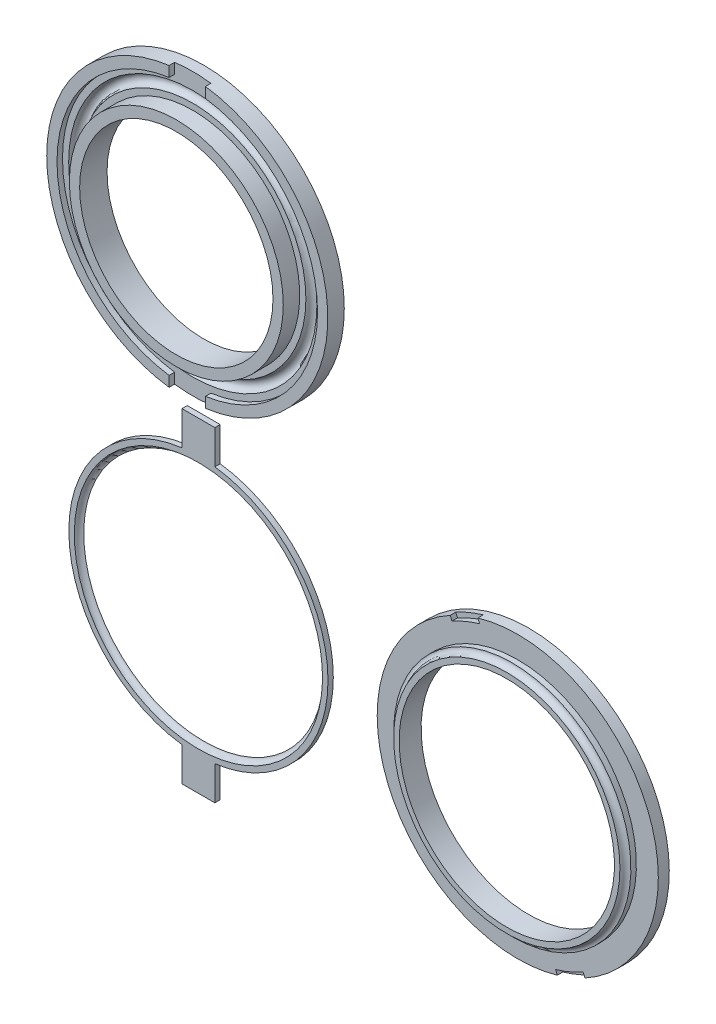
ISO-10303-21;
HEADER;
FILE_DESCRIPTION(('STEP AP214'),'2;1');
FILE_NAME('part.step','',(''),(''),'','','');
FILE_SCHEMA(('AUTOMOTIVE_DESIGN { 1 0 10303 214 1 1 1 1 }'));
ENDSEC;
DATA;
#1=APPLICATION_CONTEXT('core data for automotive mechanical design processes');
#2=APPLICATION_PROTOCOL_DEFINITION('international standard','automotive_design',2000,#1);
#3=PRODUCT_CONTEXT('',#1,'mechanical');
#4=PRODUCT('Part','Part','',(#3));
#5=PRODUCT_RELATED_PRODUCT_CATEGORY('part','',(#4));
#6=PRODUCT_DEFINITION_FORMATION('','',#4);
#7=PRODUCT_DEFINITION_CONTEXT('part definition',#1,'design');
#8=PRODUCT_DEFINITION('design','',#6,#7);
#9=PRODUCT_DEFINITION_SHAPE('','',#8);
#10=(LENGTH_UNIT() NAMED_UNIT(*) SI_UNIT(.MILLI.,.METRE.));
#11=(NAMED_UNIT(*) PLANE_ANGLE_UNIT() SI_UNIT($,.RADIAN.));
#12=(NAMED_UNIT(*) SI_UNIT($,.STERADIAN.) SOLID_ANGLE_UNIT());
#13=UNCERTAINTY_MEASURE_WITH_UNIT(LENGTH_MEASURE(1.E-05),#10,'distance_accuracy_value','');
#14=(GEOMETRIC_REPRESENTATION_CONTEXT(3) GLOBAL_UNCERTAINTY_ASSIGNED_CONTEXT((#13)) GLOBAL_UNIT_ASSIGNED_CONTEXT((#10,
#11,#12)) REPRESENTATION_CONTEXT('',''));
#15=CARTESIAN_POINT('',(0.,0.,0.));
#16=DIRECTION('',(0.,0.,1.));
#17=DIRECTION('',(1.,0.,0.));
#18=AXIS2_PLACEMENT_3D('',#15,#16,#17);
#19=CARTESIAN_POINT('',(0.,47.4,1.62540333075852));
#20=DIRECTION('',(0.,0.,-1.));
#21=DIRECTION('',(-1.,0.,0.));
#22=AXIS2_PLACEMENT_3D('',#19,#20,#21);
#23=CYLINDRICAL_SURFACE('',#22,19.);
#24=CARTESIAN_POINT('',(0.,47.4,1.62540333075852));
#25=DIRECTION('',(0.,0.,1.));
#26=DIRECTION('',(1.,0.,0.));
#27=AXIS2_PLACEMENT_3D('',#24,#25,#26);
#28=CIRCLE('',#27,19.);
#29=CARTESIAN_POINT('',(-2.65,66.2142897819716,1.62540333075852));
#30=VERTEX_POINT('',#29);
#31=CARTESIAN_POINT('',(-2.65,28.5857102180284,1.62540333075852));
#32=VERTEX_POINT('',#31);
#33=EDGE_CURVE('E437',#30,#32,#28,.T.);
#34=ORIENTED_EDGE('',*,*,#33,.T.);
#35=DIRECTION('',(0.,0.,1.));
#36=VECTOR('',#35,1.);
#37=CARTESIAN_POINT('',(-2.65,28.5857102180284,-4.73621684138246));
#38=LINE('',#37,#36);
#39=CARTESIAN_POINT('',(-2.65,28.5857102180284,0.825403330758516));
#40=VERTEX_POINT('',#39);
#41=EDGE_CURVE('E109',#40,#32,#38,.T.);
#42=ORIENTED_EDGE('',*,*,#41,.F.);
#43=CARTESIAN_POINT('',(0.,47.4,0.825403330758516));
#44=DIRECTION('',(0.,0.,1.));
#45=DIRECTION('',(1.,0.,0.));
#46=AXIS2_PLACEMENT_3D('',#43,#44,#45);
#47=CIRCLE('',#46,19.);
#48=CARTESIAN_POINT('',(-2.65,66.2142897819716,0.825403330758516));
#49=VERTEX_POINT('',#48);
#50=EDGE_CURVE('E182',#49,#40,#47,.T.);
#51=ORIENTED_EDGE('',*,*,#50,.F.);
#52=DIRECTION('',(0.,0.,1.));
#53=VECTOR('',#52,1.);
#54=CARTESIAN_POINT('',(-2.65,66.2142897819716,-4.73621684138246));
#55=LINE('',#54,#53);
#56=EDGE_CURVE('E452',#49,#30,#55,.T.);
#57=ORIENTED_EDGE('',*,*,#56,.T.);
#58=EDGE_LOOP('',(#34,#42,#51,#57));
#59=FACE_BOUND('',#58,.T.);
#60=ADVANCED_FACE('F86',(#59),#23,.F.);
#61=CARTESIAN_POINT('',(0.,47.4,1.62540333075852));
#62=DIRECTION('',(0.,0.,1.));
#63=DIRECTION('',(1.,0.,0.));
#64=AXIS2_PLACEMENT_3D('',#61,#62,#63);
#65=PLANE('',#64);
#66=CARTESIAN_POINT('',(0.,47.4,1.62540333075852));
#67=DIRECTION('',(0.,0.,1.));
#68=DIRECTION('',(1.,0.,0.));
#69=AXIS2_PLACEMENT_3D('',#66,#67,#68);
#70=CIRCLE('',#69,20.5);
#71=CARTESIAN_POINT('',(-2.65,67.7279979338842,1.62540333075852));
#72=VERTEX_POINT('',#71);
#73=CARTESIAN_POINT('',(-2.65,27.0720020661158,1.62540333075852));
#74=VERTEX_POINT('',#73);
#75=EDGE_CURVE('E196',#72,#74,#70,.T.);
#76=ORIENTED_EDGE('',*,*,#75,.T.);
#77=DIRECTION('',(0.,1.,0.));
#78=VECTOR('',#77,1.);
#79=CARTESIAN_POINT('',(-2.65,0.,1.62540333075852));
#80=LINE('',#79,#78);
#81=EDGE_CURVE('E463',#74,#32,#80,.T.);
#82=ORIENTED_EDGE('',*,*,#81,.T.);
#83=ORIENTED_EDGE('',*,*,#33,.F.);
#84=DIRECTION('',(0.,1.,0.));
#85=VECTOR('',#84,1.);
#86=CARTESIAN_POINT('',(-2.65,0.,1.62540333075852));
#87=LINE('',#86,#85);
#88=EDGE_CURVE('E454',#30,#72,#87,.T.);
#89=ORIENTED_EDGE('',*,*,#88,.T.);
#90=EDGE_LOOP('',(#76,#82,#83,#89));
#91=FACE_BOUND('',#90,.T.);
#92=ADVANCED_FACE('F229',(#91),#65,.T.);
#93=CARTESIAN_POINT('',(0.,47.4,1.62540333075852));
#94=DIRECTION('',(0.,0.,-1.));
#95=DIRECTION('',(-1.,0.,0.));
#96=AXIS2_PLACEMENT_3D('',#93,#94,#95);
#97=CYLINDRICAL_SURFACE('',#96,14.1);
#98=CARTESIAN_POINT('',(0.,47.4,3.22540333075852));
#99=DIRECTION('',(0.,0.,1.));
#100=DIRECTION('',(1.,0.,0.));
#101=AXIS2_PLACEMENT_3D('',#98,#99,#100);
#102=CIRCLE('',#101,14.1);
#103=CARTESIAN_POINT('',(14.1,47.4,3.22540333075852));
#104=VERTEX_POINT('',#103);
#105=EDGE_CURVE('E94',#104,#104,#102,.T.);
#106=ORIENTED_EDGE('',*,*,#105,.T.);
#107=EDGE_LOOP('',(#106));
#108=FACE_BOUND('',#107,.T.);
#109=CARTESIAN_POINT('',(0.,47.4,-0.774596669241484));
#110=DIRECTION('',(0.,0.,-1.));
#111=DIRECTION('',(-1.,0.,0.));
#112=AXIS2_PLACEMENT_3D('',#109,#110,#111);
#113=CIRCLE('',#112,14.1);
#114=CARTESIAN_POINT('',(-14.1,47.4,-0.774596669241484));
#115=VERTEX_POINT('',#114);
#116=EDGE_CURVE('E204',#115,#115,#113,.T.);
#117=ORIENTED_EDGE('',*,*,#116,.T.);
#118=EDGE_LOOP('',(#117));
#119=FACE_BOUND('',#118,.T.);
#120=ADVANCED_FACE('F88',(#108,#119),#97,.F.);
#121=CARTESIAN_POINT('',(0.,47.4,1.62540333075852));
#122=DIRECTION('',(0.,0.,-1.));
#123=DIRECTION('',(-1.,0.,0.));
#124=AXIS2_PLACEMENT_3D('',#121,#122,#123);
#125=CYLINDRICAL_SURFACE('',#124,15.6);
#126=CARTESIAN_POINT('',(0.,47.4,0.825403330758516));
#127=DIRECTION('',(0.,0.,-1.));
#128=DIRECTION('',(-1.,0.,0.));
#129=AXIS2_PLACEMENT_3D('',#126,#127,#128);
#130=CIRCLE('',#129,15.6);
#131=CARTESIAN_POINT('',(-15.6,47.4,0.825403330758516));
#132=VERTEX_POINT('',#131);
#133=EDGE_CURVE('E207',#132,#132,#130,.T.);
#134=ORIENTED_EDGE('',*,*,#133,.F.);
#135=EDGE_LOOP('',(#134));
#136=FACE_BOUND('',#135,.T.);
#137=CARTESIAN_POINT('',(0.,47.4,3.22540333075852));
#138=DIRECTION('',(0.,0.,1.));
#139=DIRECTION('',(1.,0.,0.));
#140=AXIS2_PLACEMENT_3D('',#137,#138,#139);
#141=CIRCLE('',#140,15.6);
#142=CARTESIAN_POINT('',(15.6,47.4,3.22540333075852));
#143=VERTEX_POINT('',#142);
#144=EDGE_CURVE('E14',#143,#143,#141,.T.);
#145=ORIENTED_EDGE('',*,*,#144,.F.);
#146=EDGE_LOOP('',(#145));
#147=FACE_BOUND('',#146,.T.);
#148=ADVANCED_FACE('F217',(#136,#147),#125,.T.);
#149=CARTESIAN_POINT('',(0.,47.4,3.22540333075852));
#150=DIRECTION('',(0.,0.,1.));
#151=DIRECTION('',(1.,0.,0.));
#152=AXIS2_PLACEMENT_3D('',#149,#150,#151);
#153=PLANE('',#152);
#154=ORIENTED_EDGE('',*,*,#144,.T.);
#155=EDGE_LOOP('',(#154));
#156=FACE_BOUND('',#155,.T.);
#157=ORIENTED_EDGE('',*,*,#105,.F.);
#158=EDGE_LOOP('',(#157));
#159=FACE_BOUND('',#158,.T.);
#160=ADVANCED_FACE('F214',(#156,#159),#153,.T.);
#161=CARTESIAN_POINT('',(0.,47.4,-0.774596669241484));
#162=DIRECTION('',(0.,0.,-1.));
#163=DIRECTION('',(-1.,0.,0.));
#164=AXIS2_PLACEMENT_3D('',#161,#162,#163);
#165=PLANE('',#164);
#166=ORIENTED_EDGE('',*,*,#116,.F.);
#167=EDGE_LOOP('',(#166));
#168=FACE_BOUND('',#167,.T.);
#169=CARTESIAN_POINT('',(0.,47.4,-0.774596669241484));
#170=DIRECTION('',(0.,0.,-1.));
#171=DIRECTION('',(-1.,0.,0.));
#172=AXIS2_PLACEMENT_3D('',#169,#170,#171);
#173=CIRCLE('',#172,20.5);
#174=CARTESIAN_POINT('',(-20.5,47.4,-0.774596669241484));
#175=VERTEX_POINT('',#174);
#176=EDGE_CURVE('E192',#175,#175,#173,.T.);
#177=ORIENTED_EDGE('',*,*,#176,.T.);
#178=EDGE_LOOP('',(#177));
#179=FACE_BOUND('',#178,.T.);
#180=ADVANCED_FACE('F216',(#168,#179),#165,.T.);
#181=CARTESIAN_POINT('',(0.,47.4,0.825403330758516));
#182=DIRECTION('',(0.,0.,-1.));
#183=DIRECTION('',(-1.,0.,0.));
#184=AXIS2_PLACEMENT_3D('',#181,#182,#183);
#185=PLANE('',#184);
#186=ORIENTED_EDGE('',*,*,#133,.T.);
#187=EDGE_LOOP('',(#186));
#188=FACE_BOUND('',#187,.T.);
#189=CARTESIAN_POINT('',(0.,47.4,0.825403330758516));
#190=DIRECTION('',(0.,0.,1.));
#191=DIRECTION('',(1.,0.,0.));
#192=AXIS2_PLACEMENT_3D('',#189,#190,#191);
#193=CIRCLE('',#192,16.5);
#194=CARTESIAN_POINT('',(16.5,47.4,0.825403330758516));
#195=VERTEX_POINT('',#194);
#196=EDGE_CURVE('E198',#195,#195,#193,.T.);
#197=ORIENTED_EDGE('',*,*,#196,.T.);
#198=EDGE_LOOP('',(#197));
#199=FACE_BOUND('',#198,.T.);
#200=ADVANCED_FACE('F224',(#188,#199),#185,.F.);
#201=CARTESIAN_POINT('',(2.65,28.5857102180284,0.825403330758516));
#202=VERTEX_POINT('',#201);
#203=CARTESIAN_POINT('',(2.65,66.2142897819716,0.825403330758516));
#204=VERTEX_POINT('',#203);
#205=EDGE_CURVE('E173',#202,#204,#47,.T.);
#206=ORIENTED_EDGE('',*,*,#205,.T.);
#207=DIRECTION('',(0.,1.,0.));
#208=VECTOR('',#207,1.);
#209=CARTESIAN_POINT('',(2.65,0.,0.825403330758516));
#210=LINE('',#209,#208);
#211=CARTESIAN_POINT('',(2.65,67.7279979338842,0.825403330758516));
#212=VERTEX_POINT('',#211);
#213=EDGE_CURVE('E446',#204,#212,#210,.T.);
#214=ORIENTED_EDGE('',*,*,#213,.T.);
#215=CARTESIAN_POINT('',(0.,47.4,0.825403330758516));
#216=DIRECTION('',(0.,0.,-1.));
#217=DIRECTION('',(-1.,0.,0.));
#218=AXIS2_PLACEMENT_3D('',#215,#216,#217);
#219=CIRCLE('',#218,20.5);
#220=CARTESIAN_POINT('',(-2.65,67.7279979338842,0.825403330758516));
#221=VERTEX_POINT('',#220);
#222=EDGE_CURVE('E443',#212,#221,#219,.F.);
#223=ORIENTED_EDGE('',*,*,#222,.T.);
#224=DIRECTION('',(0.,1.,0.));
#225=VECTOR('',#224,1.);
#226=CARTESIAN_POINT('',(-2.65,0.,0.825403330758516));
#227=LINE('',#226,#225);
#228=EDGE_CURVE('E441',#49,#221,#227,.T.);
#229=ORIENTED_EDGE('',*,*,#228,.F.);
#230=ORIENTED_EDGE('',*,*,#50,.T.);
#231=DIRECTION('',(0.,1.,0.));
#232=VECTOR('',#231,1.);
#233=CARTESIAN_POINT('',(-2.65,0.,0.825403330758516));
#234=LINE('',#233,#232);
#235=CARTESIAN_POINT('',(-2.65,27.0720020661158,0.825403330758516));
#236=VERTEX_POINT('',#235);
#237=EDGE_CURVE('E430',#236,#40,#234,.T.);
#238=ORIENTED_EDGE('',*,*,#237,.F.);
#239=CARTESIAN_POINT('',(0.,47.4,0.825403330758516));
#240=DIRECTION('',(0.,0.,-1.));
#241=DIRECTION('',(-1.,0.,0.));
#242=AXIS2_PLACEMENT_3D('',#239,#240,#241);
#243=CIRCLE('',#242,20.5);
#244=CARTESIAN_POINT('',(2.65,27.0720020661158,0.825403330758516));
#245=VERTEX_POINT('',#244);
#246=EDGE_CURVE('E176',#236,#245,#243,.F.);
#247=ORIENTED_EDGE('',*,*,#246,.T.);
#248=DIRECTION('',(0.,1.,0.));
#249=VECTOR('',#248,1.);
#250=CARTESIAN_POINT('',(2.65,0.,0.825403330758516));
#251=LINE('',#250,#249);
#252=EDGE_CURVE('E159',#245,#202,#251,.T.);
#253=ORIENTED_EDGE('',*,*,#252,.T.);
#254=EDGE_LOOP('',(#206,#214,#223,#229,#230,#238,#247,#253));
#255=FACE_BOUND('',#254,.T.);
#256=CARTESIAN_POINT('',(0.,47.4,0.825403330758516));
#257=DIRECTION('',(0.,0.,-1.));
#258=DIRECTION('',(-1.,0.,0.));
#259=AXIS2_PLACEMENT_3D('',#256,#257,#258);
#260=CIRCLE('',#259,18.1);
#261=CARTESIAN_POINT('',(18.1,47.4,0.825403330758516));
#262=VERTEX_POINT('',#261);
#263=EDGE_CURVE('E201',#262,#262,#260,.T.);
#264=ORIENTED_EDGE('',*,*,#263,.T.);
#265=EDGE_LOOP('',(#264));
#266=FACE_BOUND('',#265,.T.);
#267=ADVANCED_FACE('F170',(#255,#266),#185,.F.);
#268=CARTESIAN_POINT('',(0.,47.4,0.825403330758516));
#269=DIRECTION('',(0.,0.,1.));
#270=DIRECTION('',(1.,0.,0.));
#271=AXIS2_PLACEMENT_3D('',#268,#269,#270);
#272=TOROIDAL_SURFACE('',#271,17.3,0.799999999999999);
#273=CARTESIAN_POINT('',(17.3,47.4,0.825403330758516));
#274=DIRECTION('',(0.,1.,0.));
#275=DIRECTION('',(-1.,0.,0.));
#276=AXIS2_PLACEMENT_3D('',#273,#274,#275);
#277=CIRCLE('',#276,0.799999999999999);
#278=EDGE_CURVE('E195',#262,#195,#277,.T.);
#279=ORIENTED_EDGE('',*,*,#278,.T.);
#280=ORIENTED_EDGE('',*,*,#196,.F.);
#281=ORIENTED_EDGE('',*,*,#278,.F.);
#282=ORIENTED_EDGE('',*,*,#263,.F.);
#283=EDGE_LOOP('',(#279,#280,#281,#282));
#284=FACE_BOUND('',#283,.T.);
#285=ADVANCED_FACE('F248',(#284),#272,.F.);
#286=CARTESIAN_POINT('',(0.,47.4,58.8081593880554));
#287=DIRECTION('',(0.,0.,-1.));
#288=DIRECTION('',(-1.,0.,0.));
#289=AXIS2_PLACEMENT_3D('',#286,#287,#288);
#290=CYLINDRICAL_SURFACE('',#289,20.5);
#291=DIRECTION('',(0.,0.,1.));
#292=VECTOR('',#291,1.);
#293=CARTESIAN_POINT('',(2.65,27.0720020661158,-4.73621684138246));
#294=LINE('',#293,#292);
#295=CARTESIAN_POINT('',(2.65,27.0720020661158,1.62540333075852));
#296=VERTEX_POINT('',#295);
#297=EDGE_CURVE('E183',#245,#296,#294,.T.);
#298=ORIENTED_EDGE('',*,*,#297,.F.);
#299=ORIENTED_EDGE('',*,*,#246,.F.);
#300=DIRECTION('',(0.,0.,1.));
#301=VECTOR('',#300,1.);
#302=CARTESIAN_POINT('',(-2.65,27.0720020661158,-4.73621684138246));
#303=LINE('',#302,#301);
#304=EDGE_CURVE('E432',#236,#74,#303,.T.);
#305=ORIENTED_EDGE('',*,*,#304,.T.);
#306=ORIENTED_EDGE('',*,*,#75,.F.);
#307=DIRECTION('',(0.,0.,1.));
#308=VECTOR('',#307,1.);
#309=CARTESIAN_POINT('',(-2.65,67.7279979338842,-4.73621684138246));
#310=LINE('',#309,#308);
#311=EDGE_CURVE('E101',#221,#72,#310,.T.);
#312=ORIENTED_EDGE('',*,*,#311,.F.);
#313=ORIENTED_EDGE('',*,*,#222,.F.);
#314=DIRECTION('',(0.,0.,1.));
#315=VECTOR('',#314,1.);
#316=CARTESIAN_POINT('',(2.65,67.7279979338842,-4.73621684138246));
#317=LINE('',#316,#315);
#318=CARTESIAN_POINT('',(2.65,67.7279979338842,1.62540333075852));
#319=VERTEX_POINT('',#318);
#320=EDGE_CURVE('E451',#212,#319,#317,.T.);
#321=ORIENTED_EDGE('',*,*,#320,.T.);
#322=EDGE_CURVE('E190',#296,#319,#70,.T.);
#323=ORIENTED_EDGE('',*,*,#322,.F.);
#324=EDGE_LOOP('',(#298,#299,#305,#306,#312,#313,#321,#323));
#325=FACE_BOUND('',#324,.T.);
#326=ORIENTED_EDGE('',*,*,#176,.F.);
#327=EDGE_LOOP('',(#326));
#328=FACE_BOUND('',#327,.T.);
#329=ADVANCED_FACE('F241',(#325,#328),#290,.T.);
#330=DIRECTION('',(0.,0.,1.));
#331=VECTOR('',#330,1.);
#332=CARTESIAN_POINT('',(2.65,28.5857102180284,-4.73621684138246));
#333=LINE('',#332,#331);
#334=CARTESIAN_POINT('',(2.65,28.5857102180284,1.62540333075852));
#335=VERTEX_POINT('',#334);
#336=EDGE_CURVE('E156',#202,#335,#333,.T.);
#337=ORIENTED_EDGE('',*,*,#336,.T.);
#338=CARTESIAN_POINT('',(2.65,66.2142897819716,1.62540333075852));
#339=VERTEX_POINT('',#338);
#340=EDGE_CURVE('E186',#335,#339,#28,.T.);
#341=ORIENTED_EDGE('',*,*,#340,.T.);
#342=DIRECTION('',(0.,0.,1.));
#343=VECTOR('',#342,1.);
#344=CARTESIAN_POINT('',(2.65,66.2142897819716,-4.73621684138246));
#345=LINE('',#344,#343);
#346=EDGE_CURVE('E181',#204,#339,#345,.T.);
#347=ORIENTED_EDGE('',*,*,#346,.F.);
#348=ORIENTED_EDGE('',*,*,#205,.F.);
#349=EDGE_LOOP('',(#337,#341,#347,#348));
#350=FACE_BOUND('',#349,.T.);
#351=ADVANCED_FACE('F180',(#350),#23,.F.);
#352=DIRECTION('',(0.,1.,0.));
#353=VECTOR('',#352,1.);
#354=CARTESIAN_POINT('',(2.65,0.,1.62540333075852));
#355=LINE('',#354,#353);
#356=EDGE_CURVE('E162',#296,#335,#355,.T.);
#357=ORIENTED_EDGE('',*,*,#356,.F.);
#358=ORIENTED_EDGE('',*,*,#322,.T.);
#359=DIRECTION('',(0.,1.,0.));
#360=VECTOR('',#359,1.);
#361=CARTESIAN_POINT('',(2.65,0.,1.62540333075852));
#362=LINE('',#361,#360);
#363=EDGE_CURVE('E444',#339,#319,#362,.T.);
#364=ORIENTED_EDGE('',*,*,#363,.F.);
#365=ORIENTED_EDGE('',*,*,#340,.F.);
#366=EDGE_LOOP('',(#357,#358,#364,#365));
#367=FACE_BOUND('',#366,.T.);
#368=ADVANCED_FACE('F237',(#367),#65,.T.);
#369=CARTESIAN_POINT('',(2.65,0.,-4.73621684138246));
#370=DIRECTION('',(1.,0.,0.));
#371=DIRECTION('',(0.,0.,-1.));
#372=AXIS2_PLACEMENT_3D('',#369,#370,#371);
#373=PLANE('',#372);
#374=ORIENTED_EDGE('',*,*,#346,.T.);
#375=ORIENTED_EDGE('',*,*,#363,.T.);
#376=ORIENTED_EDGE('',*,*,#320,.F.);
#377=ORIENTED_EDGE('',*,*,#213,.F.);
#378=EDGE_LOOP('',(#374,#375,#376,#377));
#379=FACE_BOUND('',#378,.T.);
#380=ADVANCED_FACE('F246',(#379),#373,.F.);
#381=CARTESIAN_POINT('',(-2.65,0.,-4.73621684138246));
#382=DIRECTION('',(1.,0.,0.));
#383=DIRECTION('',(0.,0.,-1.));
#384=AXIS2_PLACEMENT_3D('',#381,#382,#383);
#385=PLANE('',#384);
#386=ORIENTED_EDGE('',*,*,#228,.T.);
#387=ORIENTED_EDGE('',*,*,#311,.T.);
#388=ORIENTED_EDGE('',*,*,#88,.F.);
#389=ORIENTED_EDGE('',*,*,#56,.F.);
#390=EDGE_LOOP('',(#386,#387,#388,#389));
#391=FACE_BOUND('',#390,.T.);
#392=ADVANCED_FACE('F392',(#391),#385,.T.);
#393=CARTESIAN_POINT('',(2.65,0.,-4.73621684138246));
#394=DIRECTION('',(1.,0.,0.));
#395=DIRECTION('',(0.,0.,-1.));
#396=AXIS2_PLACEMENT_3D('',#393,#394,#395);
#397=PLANE('',#396);
#398=ORIENTED_EDGE('',*,*,#297,.T.);
#399=ORIENTED_EDGE('',*,*,#356,.T.);
#400=ORIENTED_EDGE('',*,*,#336,.F.);
#401=ORIENTED_EDGE('',*,*,#252,.F.);
#402=EDGE_LOOP('',(#398,#399,#400,#401));
#403=FACE_BOUND('',#402,.T.);
#404=ADVANCED_FACE('F158',(#403),#397,.F.);
#405=CARTESIAN_POINT('',(-2.65,0.,-4.73621684138246));
#406=DIRECTION('',(1.,0.,0.));
#407=DIRECTION('',(0.,0.,-1.));
#408=AXIS2_PLACEMENT_3D('',#405,#406,#407);
#409=PLANE('',#408);
#410=ORIENTED_EDGE('',*,*,#237,.T.);
#411=ORIENTED_EDGE('',*,*,#41,.T.);
#412=ORIENTED_EDGE('',*,*,#81,.F.);
#413=ORIENTED_EDGE('',*,*,#304,.F.);
#414=EDGE_LOOP('',(#410,#411,#412,#413));
#415=FACE_BOUND('',#414,.T.);
#416=ADVANCED_FACE('F409',(#415),#409,.T.);
#417=CLOSED_SHELL('',(#60,#92,#120,#148,#160,#180,#200,#267,#285,#329,#351,#368,#380,#392,#404,#416));
#418=MANIFOLD_SOLID_BREP('B2',#417);
#419=CARTESIAN_POINT('',(47.4,0.,-0.774596669241484));
#420=DIRECTION('',(0.,0.,1.));
#421=DIRECTION('',(0.923728021347068,0.383049008063238,0.));
#422=AXIS2_PLACEMENT_3D('',#419,#420,#421);
#423=CYLINDRICAL_SURFACE('',#422,20.5);
#424=CARTESIAN_POINT('',(47.4,0.,-0.774596669241484));
#425=DIRECTION('',(0.,0.,-1.));
#426=DIRECTION('',(-0.923728021347068,-0.383049008063238,0.));
#427=AXIS2_PLACEMENT_3D('',#424,#425,#426);
#428=CIRCLE('',#427,20.5);
#429=CARTESIAN_POINT('',(28.4635755623851,-7.85250466529638,-0.774596669241484));
#430=VERTEX_POINT('',#429);
#431=EDGE_CURVE('E615',#430,#430,#428,.T.);
#432=ORIENTED_EDGE('',*,*,#431,.F.);
#433=EDGE_LOOP('',(#432));
#434=FACE_BOUND('',#433,.T.);
#435=DIRECTION('',(0.,0.,1.));
#436=VECTOR('',#435,1.);
#437=CARTESIAN_POINT('',(53.1721970346364,-19.6705806064116,-0.774596669241484));
#438=LINE('',#437,#436);
#439=CARTESIAN_POINT('',(53.1721970346364,-19.6705806064116,0.825403330758519));
#440=VERTEX_POINT('',#439);
#441=CARTESIAN_POINT('',(53.1721970346364,-19.6705806064116,0.0254033307585202));
#442=VERTEX_POINT('',#441);
#443=EDGE_CURVE('E84',#440,#442,#438,.F.);
#444=ORIENTED_EDGE('',*,*,#443,.F.);
#445=CARTESIAN_POINT('',(47.4,0.,0.825403330758516));
#446=DIRECTION('',(0.,0.,-1.));
#447=DIRECTION('',(-0.923728021347068,-0.383049008063238,0.));
#448=AXIS2_PLACEMENT_3D('',#445,#446,#447);
#449=CIRCLE('',#448,20.5);
#450=CARTESIAN_POINT('',(37.5581228867834,17.9829768083135,0.825403330758519));
#451=VERTEX_POINT('',#450);
#452=EDGE_CURVE('E622',#440,#451,#449,.T.);
#453=ORIENTED_EDGE('',*,*,#452,.T.);
#454=DIRECTION('',(0.,0.,1.));
#455=VECTOR('',#454,1.);
#456=CARTESIAN_POINT('',(37.5581228867834,17.9829768083136,-0.774596669241484));
#457=LINE('',#456,#455);
#458=CARTESIAN_POINT('',(37.5581228867834,17.9829768083136,0.0254033307585202));
#459=VERTEX_POINT('',#458);
#460=EDGE_CURVE('E635',#451,#459,#457,.F.);
#461=ORIENTED_EDGE('',*,*,#460,.T.);
#462=CARTESIAN_POINT('',(47.4,0.,0.0254033307585202));
#463=DIRECTION('',(0.,0.,-1.));
#464=DIRECTION('',(-0.923728021347068,-0.383049008063238,0.));
#465=AXIS2_PLACEMENT_3D('',#462,#463,#464);
#466=CIRCLE('',#465,20.5);
#467=CARTESIAN_POINT('',(41.5804310803162,19.6566176538348,0.0254033307585202));
#468=VERTEX_POINT('',#467);
#469=EDGE_CURVE('E642',#459,#468,#466,.T.);
#470=ORIENTED_EDGE('',*,*,#469,.T.);
#471=DIRECTION('',(0.,0.,1.));
#472=VECTOR('',#471,1.);
#473=CARTESIAN_POINT('',(41.5804310803162,19.6566176538348,-0.774596669241484));
#474=LINE('',#473,#472);
#475=CARTESIAN_POINT('',(41.5804310803162,19.6566176538348,0.825403330758519));
#476=VERTEX_POINT('',#475);
#477=EDGE_CURVE('E645',#468,#476,#474,.T.);
#478=ORIENTED_EDGE('',*,*,#477,.T.);
#479=CARTESIAN_POINT('',(57.1985255443311,-18.0066348093443,0.825403330758519));
#480=VERTEX_POINT('',#479);
#481=EDGE_CURVE('E619',#476,#480,#449,.T.);
#482=ORIENTED_EDGE('',*,*,#481,.T.);
#483=DIRECTION('',(0.,0.,1.));
#484=VECTOR('',#483,1.);
#485=CARTESIAN_POINT('',(57.1985255443311,-18.0066348093443,-0.774596669241484));
#486=LINE('',#485,#484);
#487=CARTESIAN_POINT('',(57.1985255443311,-18.0066348093443,0.0254033307585202));
#488=VERTEX_POINT('',#487);
#489=EDGE_CURVE('E504',#488,#480,#486,.T.);
#490=ORIENTED_EDGE('',*,*,#489,.F.);
#491=CARTESIAN_POINT('',(47.4,0.,0.0254033307585202));
#492=DIRECTION('',(0.,0.,1.));
#493=DIRECTION('',(0.923728021347068,0.383049008063238,0.));
#494=AXIS2_PLACEMENT_3D('',#491,#492,#493);
#495=CIRCLE('',#494,20.5);
#496=EDGE_CURVE('E570',#442,#488,#495,.T.);
#497=ORIENTED_EDGE('',*,*,#496,.F.);
#498=EDGE_LOOP('',(#444,#453,#461,#470,#478,#482,#490,#497));
#499=FACE_BOUND('',#498,.T.);
#500=ADVANCED_FACE('F496',(#434,#499),#423,.T.);
#501=CARTESIAN_POINT('',(47.4,0.,0.825403330758516));
#502=DIRECTION('',(0.,0.,-1.));
#503=DIRECTION('',(-0.923728021347068,-0.383049008063238,0.));
#504=AXIS2_PLACEMENT_3D('',#501,#502,#503);
#505=PLANE('',#504);
#506=DIRECTION('',(0.383049008063238,-0.923728021347068,0.));
#507=VECTOR('',#506,1.);
#508=CARTESIAN_POINT('',(37.0143085359232,19.2943926943384,0.825403330758519));
#509=LINE('',#508,#507);
#510=CARTESIAN_POINT('',(52.9217172110847,-19.0665450210785,0.825403330758519));
#511=VERTEX_POINT('',#510);
#512=EDGE_CURVE('E596',#511,#440,#509,.T.);
#513=ORIENTED_EDGE('',*,*,#512,.F.);
#514=CARTESIAN_POINT('',(47.4,0.,0.825403330758519));
#515=DIRECTION('',(0.,0.,-1.));
#516=DIRECTION('',(-0.923728021347068,-0.383049008063238,0.));
#517=AXIS2_PLACEMENT_3D('',#514,#515,#516);
#518=CIRCLE('',#517,19.85);
#519=CARTESIAN_POINT('',(56.9481123341726,-17.4027598631372,0.825403330758519));
#520=VERTEX_POINT('',#519);
#521=EDGE_CURVE('E588',#511,#520,#518,.F.);
#522=ORIENTED_EDGE('',*,*,#521,.T.);
#523=DIRECTION('',(0.383049008063238,-0.923728021347068,0.));
#524=VECTOR('',#523,1.);
#525=CARTESIAN_POINT('',(41.0386268875371,20.9631860156327,0.825403330758519));
#526=LINE('',#525,#524);
#527=EDGE_CURVE('E574',#520,#480,#526,.T.);
#528=ORIENTED_EDGE('',*,*,#527,.T.);
#529=ORIENTED_EDGE('',*,*,#481,.F.);
#530=DIRECTION('',(-0.383049008063238,0.923728021347068,0.));
#531=VECTOR('',#530,1.);
#532=CARTESIAN_POINT('',(58.046768943561,-20.0521855882199,0.825403330758519));
#533=LINE('',#532,#531);
#534=CARTESIAN_POINT('',(41.8308442904747,19.0527427076277,0.825403330758519));
#535=VERTEX_POINT('',#534);
#536=EDGE_CURVE('E591',#535,#476,#533,.T.);
#537=ORIENTED_EDGE('',*,*,#536,.F.);
#538=CARTESIAN_POINT('',(47.4,0.,0.825403330758519));
#539=DIRECTION('',(0.,0.,1.));
#540=DIRECTION('',(0.923728021347068,0.383049008063238,0.));
#541=AXIS2_PLACEMENT_3D('',#538,#539,#540);
#542=CIRCLE('',#541,19.85);
#543=CARTESIAN_POINT('',(37.8086027103351,17.3789412229804,0.825403330758519));
#544=VERTEX_POINT('',#543);
#545=EDGE_CURVE('E587',#544,#535,#542,.F.);
#546=ORIENTED_EDGE('',*,*,#545,.F.);
#547=DIRECTION('',(-0.383049008063238,0.923728021347068,0.));
#548=VECTOR('',#547,1.);
#549=CARTESIAN_POINT('',(54.0224505919471,-21.7209789095142,0.825403330758519));
#550=LINE('',#549,#548);
#551=EDGE_CURVE('E600',#544,#451,#550,.T.);
#552=ORIENTED_EDGE('',*,*,#551,.T.);
#553=ORIENTED_EDGE('',*,*,#452,.F.);
#554=EDGE_LOOP('',(#513,#522,#528,#529,#537,#546,#552,#553));
#555=FACE_BOUND('',#554,.T.);
#556=CARTESIAN_POINT('',(47.4,0.,0.825403330758516));
#557=DIRECTION('',(0.,0.,-1.));
#558=DIRECTION('',(-0.923728021347068,-0.383049008063238,0.));
#559=AXIS2_PLACEMENT_3D('',#556,#557,#558);
#560=CIRCLE('',#559,17.3);
#561=CARTESIAN_POINT('',(31.4195052306957,-6.62674783949402,0.825403330758516));
#562=VERTEX_POINT('',#561);
#563=EDGE_CURVE('E618',#562,#562,#560,.F.);
#564=ORIENTED_EDGE('',*,*,#563,.F.);
#565=EDGE_LOOP('',(#564));
#566=FACE_BOUND('',#565,.T.);
#567=ADVANCED_FACE('F652',(#555,#566),#505,.F.);
#568=CARTESIAN_POINT('',(47.4,0.,2.42540333075852));
#569=DIRECTION('',(0.,0.,-1.));
#570=DIRECTION('',(-0.923728021347068,-0.383049008063238,0.));
#571=AXIS2_PLACEMENT_3D('',#568,#569,#570);
#572=TOROIDAL_SURFACE('',#571,17.3,0.799999999999999);
#573=CARTESIAN_POINT('',(31.4195052306957,-6.62674783949401,2.42540333075852));
#574=DIRECTION('',(-0.383049008063235,0.92372802134707,0.));
#575=DIRECTION('',(0.92372802134707,0.383049008063235,0.));
#576=AXIS2_PLACEMENT_3D('',#573,#574,#575);
#577=CIRCLE('',#576,0.799999999999999);
#578=CARTESIAN_POINT('',(32.1584876477734,-6.32030863304343,2.42540333075852));
#579=VERTEX_POINT('',#578);
#580=CARTESIAN_POINT('',(31.4195052306957,-6.62674783949402,1.62540333075852));
#581=VERTEX_POINT('',#580);
#582=EDGE_CURVE('E626',#579,#581,#577,.T.);
#583=ORIENTED_EDGE('',*,*,#582,.T.);
#584=CARTESIAN_POINT('',(47.4,0.,1.62540333075852));
#585=DIRECTION('',(0.,0.,1.));
#586=DIRECTION('',(0.923728021347068,0.383049008063238,0.));
#587=AXIS2_PLACEMENT_3D('',#584,#585,#586);
#588=CIRCLE('',#587,17.3);
#589=EDGE_CURVE('E625',#581,#581,#588,.T.);
#590=ORIENTED_EDGE('',*,*,#589,.T.);
#591=ORIENTED_EDGE('',*,*,#582,.F.);
#592=CARTESIAN_POINT('',(47.4,0.,2.42540333075852));
#593=DIRECTION('',(0.,0.,1.));
#594=DIRECTION('',(0.923728021347068,0.383049008063238,0.));
#595=AXIS2_PLACEMENT_3D('',#592,#593,#594);
#596=CIRCLE('',#595,16.5);
#597=EDGE_CURVE('E632',#579,#579,#596,.T.);
#598=ORIENTED_EDGE('',*,*,#597,.F.);
#599=EDGE_LOOP('',(#583,#590,#591,#598));
#600=FACE_BOUND('',#599,.T.);
#601=ADVANCED_FACE('F686',(#600),#572,.F.);
#602=CARTESIAN_POINT('',(47.4,0.,2.42540333075852));
#603=DIRECTION('',(0.,0.,-1.));
#604=DIRECTION('',(-0.923728021347068,-0.383049008063238,0.));
#605=AXIS2_PLACEMENT_3D('',#602,#603,#604);
#606=PLANE('',#605);
#607=CARTESIAN_POINT('',(47.4,0.,2.42540333075852));
#608=DIRECTION('',(0.,0.,-1.));
#609=DIRECTION('',(-0.923728021347068,-0.383049008063238,0.));
#610=AXIS2_PLACEMENT_3D('',#607,#608,#609);
#611=CIRCLE('',#610,15.7);
#612=CARTESIAN_POINT('',(32.897470064851,-6.01386942659283,2.42540333075852));
#613=VERTEX_POINT('',#612);
#614=EDGE_CURVE('E629',#613,#613,#611,.T.);
#615=ORIENTED_EDGE('',*,*,#614,.T.);
#616=EDGE_LOOP('',(#615));
#617=FACE_BOUND('',#616,.T.);
#618=ORIENTED_EDGE('',*,*,#597,.T.);
#619=EDGE_LOOP('',(#618));
#620=FACE_BOUND('',#619,.T.);
#621=ADVANCED_FACE('F498',(#617,#620),#606,.F.);
#622=CARTESIAN_POINT('',(47.4,0.,0.825403330758516));
#623=DIRECTION('',(0.,0.,1.));
#624=DIRECTION('',(0.923728021347068,0.383049008063238,0.));
#625=AXIS2_PLACEMENT_3D('',#622,#623,#624);
#626=CYLINDRICAL_SURFACE('',#625,15.7);
#627=ORIENTED_EDGE('',*,*,#614,.F.);
#628=EDGE_LOOP('',(#627));
#629=FACE_BOUND('',#628,.T.);
#630=CARTESIAN_POINT('',(47.4,0.,-0.774596669241485));
#631=DIRECTION('',(0.,0.,-1.));
#632=DIRECTION('',(-0.923728021347068,-0.383049008063238,0.));
#633=AXIS2_PLACEMENT_3D('',#630,#631,#632);
#634=CIRCLE('',#633,15.7);
#635=CARTESIAN_POINT('',(32.897470064851,-6.01386942659283,-0.774596669241485));
#636=VERTEX_POINT('',#635);
#637=EDGE_CURVE('E610',#636,#636,#634,.T.);
#638=ORIENTED_EDGE('',*,*,#637,.T.);
#639=EDGE_LOOP('',(#638));
#640=FACE_BOUND('',#639,.T.);
#641=ADVANCED_FACE('F695',(#629,#640),#626,.F.);
#642=CARTESIAN_POINT('',(47.4,0.,0.825403330758516));
#643=DIRECTION('',(0.,0.,1.));
#644=DIRECTION('',(0.923728021347068,0.383049008063238,0.));
#645=AXIS2_PLACEMENT_3D('',#642,#643,#644);
#646=CYLINDRICAL_SURFACE('',#645,17.3);
#647=ORIENTED_EDGE('',*,*,#563,.T.);
#648=EDGE_LOOP('',(#647));
#649=FACE_BOUND('',#648,.T.);
#650=ORIENTED_EDGE('',*,*,#589,.F.);
#651=EDGE_LOOP('',(#650));
#652=FACE_BOUND('',#651,.T.);
#653=ADVANCED_FACE('F691',(#649,#652),#646,.T.);
#654=CARTESIAN_POINT('',(47.4,0.,-0.774596669241484));
#655=DIRECTION('',(0.,0.,-1.));
#656=DIRECTION('',(-0.923728021347068,-0.383049008063238,0.));
#657=AXIS2_PLACEMENT_3D('',#654,#655,#656);
#658=PLANE('',#657);
#659=ORIENTED_EDGE('',*,*,#637,.F.);
#660=EDGE_LOOP('',(#659));
#661=FACE_BOUND('',#660,.T.);
#662=ORIENTED_EDGE('',*,*,#431,.T.);
#663=EDGE_LOOP('',(#662));
#664=FACE_BOUND('',#663,.T.);
#665=ADVANCED_FACE('F694',(#661,#664),#658,.T.);
#666=CARTESIAN_POINT('',(58.046768943561,-20.0521855882199,0.825403330758519));
#667=DIRECTION('',(0.923728021347068,0.383049008063238,0.));
#668=DIRECTION('',(0.,0.,-1.));
#669=AXIS2_PLACEMENT_3D('',#666,#667,#668);
#670=PLANE('',#669);
#671=DIRECTION('',(-0.383049008063238,0.923728021347068,0.));
#672=VECTOR('',#671,1.);
#673=CARTESIAN_POINT('',(58.046768943561,-20.0521855882199,0.0254033307585202));
#674=LINE('',#673,#672);
#675=CARTESIAN_POINT('',(41.8308442904747,19.0527427076277,0.0254033307585202));
#676=VERTEX_POINT('',#675);
#677=EDGE_CURVE('E604',#676,#468,#674,.T.);
#678=ORIENTED_EDGE('',*,*,#677,.F.);
#679=DIRECTION('',(0.,0.,1.));
#680=VECTOR('',#679,1.);
#681=CARTESIAN_POINT('',(41.8308442904747,19.0527427076277,-0.774596669241484));
#682=LINE('',#681,#680);
#683=EDGE_CURVE('E605',#535,#676,#682,.F.);
#684=ORIENTED_EDGE('',*,*,#683,.F.);
#685=ORIENTED_EDGE('',*,*,#536,.T.);
#686=ORIENTED_EDGE('',*,*,#477,.F.);
#687=EDGE_LOOP('',(#678,#684,#685,#686));
#688=FACE_BOUND('',#687,.T.);
#689=ADVANCED_FACE('F658',(#688),#670,.F.);
#690=CARTESIAN_POINT('',(58.046768943561,-20.0521855882199,0.0254033307585202));
#691=DIRECTION('',(0.,0.,-1.));
#692=DIRECTION('',(-0.923728021347068,-0.383049008063238,0.));
#693=AXIS2_PLACEMENT_3D('',#690,#691,#692);
#694=PLANE('',#693);
#695=DIRECTION('',(-0.383049008063238,0.923728021347068,0.));
#696=VECTOR('',#695,1.);
#697=CARTESIAN_POINT('',(54.0224505919471,-21.7209789095142,0.0254033307585202));
#698=LINE('',#697,#696);
#699=CARTESIAN_POINT('',(37.8086027103351,17.3789412229804,0.0254033307585202));
#700=VERTEX_POINT('',#699);
#701=EDGE_CURVE('E518',#700,#459,#698,.T.);
#702=ORIENTED_EDGE('',*,*,#701,.F.);
#703=CARTESIAN_POINT('',(47.4,0.,0.0254033307585202));
#704=DIRECTION('',(0.,0.,-1.));
#705=DIRECTION('',(-0.923728021347068,-0.383049008063238,0.));
#706=AXIS2_PLACEMENT_3D('',#703,#704,#705);
#707=CIRCLE('',#706,19.85);
#708=EDGE_CURVE('E601',#676,#700,#707,.F.);
#709=ORIENTED_EDGE('',*,*,#708,.F.);
#710=ORIENTED_EDGE('',*,*,#677,.T.);
#711=ORIENTED_EDGE('',*,*,#469,.F.);
#712=EDGE_LOOP('',(#702,#709,#710,#711));
#713=FACE_BOUND('',#712,.T.);
#714=ADVANCED_FACE('F660',(#713),#694,.F.);
#715=CARTESIAN_POINT('',(54.0224505919471,-21.7209789095142,0.825403330758519));
#716=DIRECTION('',(-0.923728021347068,-0.383049008063238,0.));
#717=DIRECTION('',(0.,0.,1.));
#718=AXIS2_PLACEMENT_3D('',#715,#716,#717);
#719=PLANE('',#718);
#720=ORIENTED_EDGE('',*,*,#551,.F.);
#721=DIRECTION('',(0.,0.,1.));
#722=VECTOR('',#721,1.);
#723=CARTESIAN_POINT('',(37.8086027103351,17.3789412229804,-0.774596669241484));
#724=LINE('',#723,#722);
#725=EDGE_CURVE('E598',#700,#544,#724,.T.);
#726=ORIENTED_EDGE('',*,*,#725,.F.);
#727=ORIENTED_EDGE('',*,*,#701,.T.);
#728=ORIENTED_EDGE('',*,*,#460,.F.);
#729=EDGE_LOOP('',(#720,#726,#727,#728));
#730=FACE_BOUND('',#729,.T.);
#731=ADVANCED_FACE('F666',(#730),#719,.F.);
#732=CARTESIAN_POINT('',(47.4,0.,-0.774596669241484));
#733=DIRECTION('',(0.,0.,1.));
#734=DIRECTION('',(0.923728021347068,0.383049008063238,0.));
#735=AXIS2_PLACEMENT_3D('',#732,#733,#734);
#736=CYLINDRICAL_SURFACE('',#735,19.85);
#737=ORIENTED_EDGE('',*,*,#725,.T.);
#738=ORIENTED_EDGE('',*,*,#545,.T.);
#739=ORIENTED_EDGE('',*,*,#683,.T.);
#740=ORIENTED_EDGE('',*,*,#708,.T.);
#741=EDGE_LOOP('',(#737,#738,#739,#740));
#742=FACE_BOUND('',#741,.T.);
#743=ADVANCED_FACE('F662',(#742),#736,.T.);
#744=CARTESIAN_POINT('',(37.0143085359232,19.2943926943384,0.825403330758519));
#745=DIRECTION('',(0.923728021347068,0.383049008063238,0.));
#746=DIRECTION('',(0.,0.,-1.));
#747=AXIS2_PLACEMENT_3D('',#744,#745,#746);
#748=PLANE('',#747);
#749=ORIENTED_EDGE('',*,*,#443,.T.);
#750=DIRECTION('',(0.383049008063238,-0.923728021347068,0.));
#751=VECTOR('',#750,1.);
#752=CARTESIAN_POINT('',(37.0143085359232,19.2943926943384,0.0254033307585202));
#753=LINE('',#752,#751);
#754=CARTESIAN_POINT('',(52.9217172110847,-19.0665450210785,0.0254033307585202));
#755=VERTEX_POINT('',#754);
#756=EDGE_CURVE('E511',#755,#442,#753,.T.);
#757=ORIENTED_EDGE('',*,*,#756,.F.);
#758=DIRECTION('',(0.,0.,1.));
#759=VECTOR('',#758,1.);
#760=CARTESIAN_POINT('',(52.9217172110847,-19.0665450210785,-0.774596669241484));
#761=LINE('',#760,#759);
#762=EDGE_CURVE('E582',#755,#511,#761,.T.);
#763=ORIENTED_EDGE('',*,*,#762,.T.);
#764=ORIENTED_EDGE('',*,*,#512,.T.);
#765=EDGE_LOOP('',(#749,#757,#763,#764));
#766=FACE_BOUND('',#765,.T.);
#767=ADVANCED_FACE('F668',(#766),#748,.T.);
#768=CARTESIAN_POINT('',(41.0386268875371,20.9631860156327,0.825403330758519));
#769=DIRECTION('',(-0.923728021347068,-0.383049008063238,0.));
#770=DIRECTION('',(0.,0.,1.));
#771=AXIS2_PLACEMENT_3D('',#768,#769,#770);
#772=PLANE('',#771);
#773=ORIENTED_EDGE('',*,*,#489,.T.);
#774=ORIENTED_EDGE('',*,*,#527,.F.);
#775=DIRECTION('',(0.,0.,1.));
#776=VECTOR('',#775,1.);
#777=CARTESIAN_POINT('',(56.9481123341726,-17.4027598631372,-0.774596669241484));
#778=LINE('',#777,#776);
#779=CARTESIAN_POINT('',(56.9481123341726,-17.4027598631372,0.0254033307585202));
#780=VERTEX_POINT('',#779);
#781=EDGE_CURVE('E579',#520,#780,#778,.F.);
#782=ORIENTED_EDGE('',*,*,#781,.T.);
#783=DIRECTION('',(0.383049008063238,-0.923728021347068,0.));
#784=VECTOR('',#783,1.);
#785=CARTESIAN_POINT('',(41.0386268875371,20.9631860156327,0.0254033307585202));
#786=LINE('',#785,#784);
#787=EDGE_CURVE('E565',#780,#488,#786,.T.);
#788=ORIENTED_EDGE('',*,*,#787,.T.);
#789=EDGE_LOOP('',(#773,#774,#782,#788));
#790=FACE_BOUND('',#789,.T.);
#791=ADVANCED_FACE('F584',(#790),#772,.T.);
#792=CARTESIAN_POINT('',(41.0386268875371,20.9631860156327,0.0254033307585202));
#793=DIRECTION('',(0.,0.,1.));
#794=DIRECTION('',(0.923728021347068,0.383049008063238,0.));
#795=AXIS2_PLACEMENT_3D('',#792,#793,#794);
#796=PLANE('',#795);
#797=ORIENTED_EDGE('',*,*,#496,.T.);
#798=ORIENTED_EDGE('',*,*,#787,.F.);
#799=CARTESIAN_POINT('',(47.4,0.,0.0254033307585202));
#800=DIRECTION('',(0.,0.,1.));
#801=DIRECTION('',(0.923728021347068,0.383049008063238,0.));
#802=AXIS2_PLACEMENT_3D('',#799,#800,#801);
#803=CIRCLE('',#802,19.85);
#804=EDGE_CURVE('E568',#780,#755,#803,.F.);
#805=ORIENTED_EDGE('',*,*,#804,.T.);
#806=ORIENTED_EDGE('',*,*,#756,.T.);
#807=EDGE_LOOP('',(#797,#798,#805,#806));
#808=FACE_BOUND('',#807,.T.);
#809=ADVANCED_FACE('F567',(#808),#796,.T.);
#810=CARTESIAN_POINT('',(47.4,0.,-0.774596669241484));
#811=DIRECTION('',(0.,0.,1.));
#812=DIRECTION('',(0.923728021347068,0.383049008063238,0.));
#813=AXIS2_PLACEMENT_3D('',#810,#811,#812);
#814=CYLINDRICAL_SURFACE('',#813,19.85);
#815=ORIENTED_EDGE('',*,*,#804,.F.);
#816=ORIENTED_EDGE('',*,*,#781,.F.);
#817=ORIENTED_EDGE('',*,*,#521,.F.);
#818=ORIENTED_EDGE('',*,*,#762,.F.);
#819=EDGE_LOOP('',(#815,#816,#817,#818));
#820=FACE_BOUND('',#819,.T.);
#821=ADVANCED_FACE('F578',(#820),#814,.T.);
#822=CLOSED_SHELL('',(#500,#567,#601,#621,#641,#653,#665,#689,#714,#731,#743,#767,#791,#809,#821));
#823=MANIFOLD_SOLID_BREP('B8',#822);
#824=CARTESIAN_POINT('',(0.,0.,-1.6));
#825=DIRECTION('',(0.,0.,1.));
#826=DIRECTION('',(0.923728021347068,0.383049008063238,0.));
#827=AXIS2_PLACEMENT_3D('',#824,#825,#826);
#828=CYLINDRICAL_SURFACE('',#827,18.9);
#829=DIRECTION('',(0.,0.,-1.));
#830=VECTOR('',#829,1.);
#831=CARTESIAN_POINT('',(2.4,-18.7469997599616,6.89726115047274));
#832=LINE('',#831,#830);
#833=CARTESIAN_POINT('',(2.4,-18.7469997599616,0.));
#834=VERTEX_POINT('',#833);
#835=CARTESIAN_POINT('',(2.4,-18.7469997599616,-0.774596669241484));
#836=VERTEX_POINT('',#835);
#837=EDGE_CURVE('E975',#834,#836,#832,.T.);
#838=ORIENTED_EDGE('',*,*,#837,.T.);
#839=CARTESIAN_POINT('',(0.,0.,-0.774596669241484));
#840=DIRECTION('',(0.,0.,1.));
#841=DIRECTION('',(1.,0.,0.));
#842=AXIS2_PLACEMENT_3D('',#839,#840,#841);
#843=CIRCLE('',#842,18.9);
#844=CARTESIAN_POINT('',(2.4,18.7469997599616,-0.774596669241484));
#845=VERTEX_POINT('',#844);
#846=EDGE_CURVE('E1011',#836,#845,#843,.T.);
#847=ORIENTED_EDGE('',*,*,#846,.T.);
#848=DIRECTION('',(0.,0.,-1.));
#849=VECTOR('',#848,1.);
#850=CARTESIAN_POINT('',(2.4,18.7469997599616,6.89726115047274));
#851=LINE('',#850,#849);
#852=CARTESIAN_POINT('',(2.4,18.7469997599616,0.));
#853=VERTEX_POINT('',#852);
#854=EDGE_CURVE('E985',#853,#845,#851,.T.);
#855=ORIENTED_EDGE('',*,*,#854,.F.);
#856=CARTESIAN_POINT('',(0.,0.,0.));
#857=DIRECTION('',(0.,0.,-1.));
#858=DIRECTION('',(-0.923728021347068,-0.383049008063238,0.));
#859=AXIS2_PLACEMENT_3D('',#856,#857,#858);
#860=CIRCLE('',#859,18.9);
#861=EDGE_CURVE('E884',#853,#834,#860,.T.);
#862=ORIENTED_EDGE('',*,*,#861,.T.);
#863=EDGE_LOOP('',(#838,#847,#855,#862));
#864=FACE_BOUND('',#863,.T.);
#865=ADVANCED_FACE('F876',(#864),#828,.T.);
#866=CARTESIAN_POINT('',(-2.4,18.7469997599616,-0.774596669241484));
#867=VERTEX_POINT('',#866);
#868=CARTESIAN_POINT('',(-2.4,-18.7469997599616,-0.774596669241484));
#869=VERTEX_POINT('',#868);
#870=EDGE_CURVE('E1012',#867,#869,#843,.T.);
#871=ORIENTED_EDGE('',*,*,#870,.T.);
#872=DIRECTION('',(0.,0.,-1.));
#873=VECTOR('',#872,1.);
#874=CARTESIAN_POINT('',(-2.4,-18.7469997599616,6.89726115047274));
#875=LINE('',#874,#873);
#876=CARTESIAN_POINT('',(-2.4,-18.7469997599616,0.));
#877=VERTEX_POINT('',#876);
#878=EDGE_CURVE('E891',#877,#869,#875,.T.);
#879=ORIENTED_EDGE('',*,*,#878,.F.);
#880=CARTESIAN_POINT('',(-2.4,18.7469997599616,0.));
#881=VERTEX_POINT('',#880);
#882=EDGE_CURVE('E1015',#877,#881,#860,.T.);
#883=ORIENTED_EDGE('',*,*,#882,.T.);
#884=DIRECTION('',(0.,0.,-1.));
#885=VECTOR('',#884,1.);
#886=CARTESIAN_POINT('',(-2.4,18.7469997599616,6.89726115047274));
#887=LINE('',#886,#885);
#888=EDGE_CURVE('E997',#881,#867,#887,.T.);
#889=ORIENTED_EDGE('',*,*,#888,.T.);
#890=EDGE_LOOP('',(#871,#879,#883,#889));
#891=FACE_BOUND('',#890,.T.);
#892=ADVANCED_FACE('F878',(#891),#828,.T.);
#893=CARTESIAN_POINT('',(0.,0.,0.));
#894=DIRECTION('',(0.,0.,-1.));
#895=DIRECTION('',(-0.923728021347068,-0.383049008063238,0.));
#896=AXIS2_PLACEMENT_3D('',#893,#894,#895);
#897=PLANE('',#896);
#898=ORIENTED_EDGE('',*,*,#861,.F.);
#899=DIRECTION('',(0.,-1.,0.));
#900=VECTOR('',#899,1.);
#901=CARTESIAN_POINT('',(2.4,0.,0.));
#902=LINE('',#901,#900);
#903=CARTESIAN_POINT('',(2.4,23.7,0.));
#904=VERTEX_POINT('',#903);
#905=EDGE_CURVE('E984',#904,#853,#902,.T.);
#906=ORIENTED_EDGE('',*,*,#905,.F.);
#907=DIRECTION('',(1.,0.,0.));
#908=VECTOR('',#907,1.);
#909=CARTESIAN_POINT('',(0.,23.7,0.));
#910=LINE('',#909,#908);
#911=CARTESIAN_POINT('',(-2.4,23.7,0.));
#912=VERTEX_POINT('',#911);
#913=EDGE_CURVE('E981',#912,#904,#910,.T.);
#914=ORIENTED_EDGE('',*,*,#913,.F.);
#915=DIRECTION('',(0.,-1.,0.));
#916=VECTOR('',#915,1.);
#917=CARTESIAN_POINT('',(-2.4,0.,0.));
#918=LINE('',#917,#916);
#919=EDGE_CURVE('E988',#912,#881,#918,.T.);
#920=ORIENTED_EDGE('',*,*,#919,.T.);
#921=ORIENTED_EDGE('',*,*,#882,.F.);
#922=DIRECTION('',(0.,-1.,0.));
#923=VECTOR('',#922,1.);
#924=CARTESIAN_POINT('',(-2.4,0.,0.));
#925=LINE('',#924,#923);
#926=CARTESIAN_POINT('',(-2.4,-23.7,0.));
#927=VERTEX_POINT('',#926);
#928=EDGE_CURVE('E978',#877,#927,#925,.T.);
#929=ORIENTED_EDGE('',*,*,#928,.T.);
#930=DIRECTION('',(1.,0.,0.));
#931=VECTOR('',#930,1.);
#932=CARTESIAN_POINT('',(0.,-23.7,0.));
#933=LINE('',#932,#931);
#934=CARTESIAN_POINT('',(2.4,-23.7,0.));
#935=VERTEX_POINT('',#934);
#936=EDGE_CURVE('E954',#927,#935,#933,.T.);
#937=ORIENTED_EDGE('',*,*,#936,.T.);
#938=DIRECTION('',(0.,-1.,0.));
#939=VECTOR('',#938,1.);
#940=CARTESIAN_POINT('',(2.4,0.,0.));
#941=LINE('',#940,#939);
#942=EDGE_CURVE('E974',#834,#935,#941,.T.);
#943=ORIENTED_EDGE('',*,*,#942,.F.);
#944=EDGE_LOOP('',(#898,#906,#914,#920,#921,#929,#937,#943));
#945=FACE_BOUND('',#944,.T.);
#946=CARTESIAN_POINT('',(0.,0.,0.));
#947=DIRECTION('',(0.,0.,-1.));
#948=DIRECTION('',(-0.923728021347068,-0.383049008063238,0.));
#949=AXIS2_PLACEMENT_3D('',#946,#947,#948);
#950=CIRCLE('',#949,18.1);
#951=CARTESIAN_POINT('',(-16.7194771863819,-6.9331870459446,0.));
#952=VERTEX_POINT('',#951);
#953=EDGE_CURVE('E850',#952,#952,#950,.T.);
#954=ORIENTED_EDGE('',*,*,#953,.T.);
#955=EDGE_LOOP('',(#954));
#956=FACE_BOUND('',#955,.T.);
#957=ADVANCED_FACE('F1020',(#945,#956),#897,.F.);
#958=CARTESIAN_POINT('',(0.,0.,0.));
#959=DIRECTION('',(0.,0.,-1.));
#960=DIRECTION('',(-0.923728021347068,-0.383049008063238,0.));
#961=AXIS2_PLACEMENT_3D('',#958,#959,#960);
#962=TOROIDAL_SURFACE('',#961,17.3,0.799999999999999);
#963=CARTESIAN_POINT('',(-15.9804947693043,-6.62674783949401,0.));
#964=DIRECTION('',(-0.383049008063235,0.92372802134707,0.));
#965=DIRECTION('',(0.92372802134707,0.383049008063235,0.));
#966=AXIS2_PLACEMENT_3D('',#963,#964,#965);
#967=CIRCLE('',#966,0.799999999999999);
#968=CARTESIAN_POINT('',(-16.1652403735737,-6.70335764110666,-0.774596669241484));
#969=VERTEX_POINT('',#968);
#970=EDGE_CURVE('E1014',#969,#952,#967,.T.);
#971=ORIENTED_EDGE('',*,*,#970,.F.);
#972=CARTESIAN_POINT('',(0.,0.,-0.774596669241484));
#973=DIRECTION('',(0.,0.,1.));
#974=DIRECTION('',(1.,0.,0.));
#975=AXIS2_PLACEMENT_3D('',#972,#973,#974);
#976=CIRCLE('',#975,17.5);
#977=EDGE_CURVE('E1008',#969,#969,#976,.F.);
#978=ORIENTED_EDGE('',*,*,#977,.T.);
#979=ORIENTED_EDGE('',*,*,#970,.T.);
#980=ORIENTED_EDGE('',*,*,#953,.F.);
#981=EDGE_LOOP('',(#971,#978,#979,#980));
#982=FACE_BOUND('',#981,.T.);
#983=ADVANCED_FACE('F1051',(#982),#962,.F.);
#984=CARTESIAN_POINT('',(0.,0.,-0.774596669241484));
#985=DIRECTION('',(0.,0.,1.));
#986=DIRECTION('',(1.,0.,0.));
#987=AXIS2_PLACEMENT_3D('',#984,#985,#986);
#988=PLANE('',#987);
#989=ORIENTED_EDGE('',*,*,#977,.F.);
#990=EDGE_LOOP('',(#989));
#991=FACE_BOUND('',#990,.T.);
#992=ORIENTED_EDGE('',*,*,#870,.F.);
#993=DIRECTION('',(0.,1.,0.));
#994=VECTOR('',#993,1.);
#995=CARTESIAN_POINT('',(-2.4,0.,-0.774596669241484));
#996=LINE('',#995,#994);
#997=CARTESIAN_POINT('',(-2.4,23.7,-0.774596669241484));
#998=VERTEX_POINT('',#997);
#999=EDGE_CURVE('E980',#867,#998,#996,.T.);
#1000=ORIENTED_EDGE('',*,*,#999,.T.);
#1001=DIRECTION('',(-1.,0.,0.));
#1002=VECTOR('',#1001,1.);
#1003=CARTESIAN_POINT('',(0.,23.7,-0.774596669241484));
#1004=LINE('',#1003,#1002);
#1005=CARTESIAN_POINT('',(2.4,23.7,-0.774596669241484));
#1006=VERTEX_POINT('',#1005);
#1007=EDGE_CURVE('E991',#1006,#998,#1004,.T.);
#1008=ORIENTED_EDGE('',*,*,#1007,.F.);
#1009=DIRECTION('',(0.,1.,0.));
#1010=VECTOR('',#1009,1.);
#1011=CARTESIAN_POINT('',(2.4,0.,-0.774596669241484));
#1012=LINE('',#1011,#1010);
#1013=EDGE_CURVE('E994',#845,#1006,#1012,.T.);
#1014=ORIENTED_EDGE('',*,*,#1013,.F.);
#1015=ORIENTED_EDGE('',*,*,#846,.F.);
#1016=DIRECTION('',(0.,1.,0.));
#1017=VECTOR('',#1016,1.);
#1018=CARTESIAN_POINT('',(2.4,0.,-0.774596669241484));
#1019=LINE('',#1018,#1017);
#1020=CARTESIAN_POINT('',(2.4,-23.7,-0.774596669241484));
#1021=VERTEX_POINT('',#1020);
#1022=EDGE_CURVE('E957',#1021,#836,#1019,.T.);
#1023=ORIENTED_EDGE('',*,*,#1022,.F.);
#1024=DIRECTION('',(-1.,0.,0.));
#1025=VECTOR('',#1024,1.);
#1026=CARTESIAN_POINT('',(0.,-23.7,-0.774596669241484));
#1027=LINE('',#1026,#1025);
#1028=CARTESIAN_POINT('',(-2.4,-23.7,-0.774596669241484));
#1029=VERTEX_POINT('',#1028);
#1030=EDGE_CURVE('E953',#1021,#1029,#1027,.T.);
#1031=ORIENTED_EDGE('',*,*,#1030,.T.);
#1032=DIRECTION('',(0.,1.,0.));
#1033=VECTOR('',#1032,1.);
#1034=CARTESIAN_POINT('',(-2.4,0.,-0.774596669241484));
#1035=LINE('',#1034,#1033);
#1036=EDGE_CURVE('E960',#1029,#869,#1035,.T.);
#1037=ORIENTED_EDGE('',*,*,#1036,.T.);
#1038=EDGE_LOOP('',(#992,#1000,#1008,#1014,#1015,#1023,#1031,#1037));
#1039=FACE_BOUND('',#1038,.T.);
#1040=ADVANCED_FACE('F965',(#991,#1039),#988,.F.);
#1041=CARTESIAN_POINT('',(2.4,0.,6.89726115047274));
#1042=DIRECTION('',(-1.,0.,0.));
#1043=DIRECTION('',(0.,0.,1.));
#1044=AXIS2_PLACEMENT_3D('',#1041,#1042,#1043);
#1045=PLANE('',#1044);
#1046=DIRECTION('',(0.,0.,-1.));
#1047=VECTOR('',#1046,1.);
#1048=CARTESIAN_POINT('',(2.4,23.7,6.89726115047274));
#1049=LINE('',#1048,#1047);
#1050=EDGE_CURVE('E1000',#904,#1006,#1049,.T.);
#1051=ORIENTED_EDGE('',*,*,#1050,.F.);
#1052=ORIENTED_EDGE('',*,*,#905,.T.);
#1053=ORIENTED_EDGE('',*,*,#854,.T.);
#1054=ORIENTED_EDGE('',*,*,#1013,.T.);
#1055=EDGE_LOOP('',(#1051,#1052,#1053,#1054));
#1056=FACE_BOUND('',#1055,.T.);
#1057=ADVANCED_FACE('F1031',(#1056),#1045,.F.);
#1058=CARTESIAN_POINT('',(0.,23.7,6.89726115047274));
#1059=DIRECTION('',(0.,-1.,0.));
#1060=DIRECTION('',(0.,0.,-1.));
#1061=AXIS2_PLACEMENT_3D('',#1058,#1059,#1060);
#1062=PLANE('',#1061);
#1063=DIRECTION('',(0.,0.,-1.));
#1064=VECTOR('',#1063,1.);
#1065=CARTESIAN_POINT('',(-2.4,23.7,6.89726115047274));
#1066=LINE('',#1065,#1064);
#1067=EDGE_CURVE('E1002',#912,#998,#1066,.T.);
#1068=ORIENTED_EDGE('',*,*,#1067,.F.);
#1069=ORIENTED_EDGE('',*,*,#913,.T.);
#1070=ORIENTED_EDGE('',*,*,#1050,.T.);
#1071=ORIENTED_EDGE('',*,*,#1007,.T.);
#1072=EDGE_LOOP('',(#1068,#1069,#1070,#1071));
#1073=FACE_BOUND('',#1072,.T.);
#1074=ADVANCED_FACE('F1028',(#1073),#1062,.F.);
#1075=CARTESIAN_POINT('',(-2.4,0.,6.89726115047274));
#1076=DIRECTION('',(-1.,0.,0.));
#1077=DIRECTION('',(0.,0.,1.));
#1078=AXIS2_PLACEMENT_3D('',#1075,#1076,#1077);
#1079=PLANE('',#1078);
#1080=ORIENTED_EDGE('',*,*,#919,.F.);
#1081=ORIENTED_EDGE('',*,*,#1067,.T.);
#1082=ORIENTED_EDGE('',*,*,#999,.F.);
#1083=ORIENTED_EDGE('',*,*,#888,.F.);
#1084=EDGE_LOOP('',(#1080,#1081,#1082,#1083));
#1085=FACE_BOUND('',#1084,.T.);
#1086=ADVANCED_FACE('F1024',(#1085),#1079,.T.);
#1087=CARTESIAN_POINT('',(0.,-23.7,6.89726115047274));
#1088=DIRECTION('',(0.,-1.,0.));
#1089=DIRECTION('',(0.,0.,-1.));
#1090=AXIS2_PLACEMENT_3D('',#1087,#1088,#1089);
#1091=PLANE('',#1090);
#1092=ORIENTED_EDGE('',*,*,#936,.F.);
#1093=DIRECTION('',(0.,0.,-1.));
#1094=VECTOR('',#1093,1.);
#1095=CARTESIAN_POINT('',(-2.4,-23.7,6.89726115047274));
#1096=LINE('',#1095,#1094);
#1097=EDGE_CURVE('E948',#927,#1029,#1096,.T.);
#1098=ORIENTED_EDGE('',*,*,#1097,.T.);
#1099=ORIENTED_EDGE('',*,*,#1030,.F.);
#1100=DIRECTION('',(0.,0.,-1.));
#1101=VECTOR('',#1100,1.);
#1102=CARTESIAN_POINT('',(2.4,-23.7,6.89726115047274));
#1103=LINE('',#1102,#1101);
#1104=EDGE_CURVE('E972',#935,#1021,#1103,.T.);
#1105=ORIENTED_EDGE('',*,*,#1104,.F.);
#1106=EDGE_LOOP('',(#1092,#1098,#1099,#1105));
#1107=FACE_BOUND('',#1106,.T.);
#1108=ADVANCED_FACE('F950',(#1107),#1091,.T.);
#1109=CARTESIAN_POINT('',(2.4,0.,6.89726115047274));
#1110=DIRECTION('',(-1.,0.,0.));
#1111=DIRECTION('',(0.,0.,1.));
#1112=AXIS2_PLACEMENT_3D('',#1109,#1110,#1111);
#1113=PLANE('',#1112);
#1114=ORIENTED_EDGE('',*,*,#837,.F.);
#1115=ORIENTED_EDGE('',*,*,#942,.T.);
#1116=ORIENTED_EDGE('',*,*,#1104,.T.);
#1117=ORIENTED_EDGE('',*,*,#1022,.T.);
#1118=EDGE_LOOP('',(#1114,#1115,#1116,#1117));
#1119=FACE_BOUND('',#1118,.T.);
#1120=ADVANCED_FACE('F1035',(#1119),#1113,.F.);
#1121=CARTESIAN_POINT('',(-2.4,0.,6.89726115047274));
#1122=DIRECTION('',(-1.,0.,0.));
#1123=DIRECTION('',(0.,0.,1.));
#1124=AXIS2_PLACEMENT_3D('',#1121,#1122,#1123);
#1125=PLANE('',#1124);
#1126=ORIENTED_EDGE('',*,*,#928,.F.);
#1127=ORIENTED_EDGE('',*,*,#878,.T.);
#1128=ORIENTED_EDGE('',*,*,#1036,.F.);
#1129=ORIENTED_EDGE('',*,*,#1097,.F.);
#1130=EDGE_LOOP('',(#1126,#1127,#1128,#1129));
#1131=FACE_BOUND('',#1130,.T.);
#1132=ADVANCED_FACE('F961',(#1131),#1125,.T.);
#1133=CLOSED_SHELL('',(#865,#892,#957,#983,#1040,#1057,#1074,#1086,#1108,#1120,#1132));
#1134=MANIFOLD_SOLID_BREP('B490',#1133);
#1135=ADVANCED_BREP_SHAPE_REPRESENTATION('',(#18,#418,#823,#1134),#14);
#1136=SHAPE_DEFINITION_REPRESENTATION(#9,#1135);
ENDSEC;
END-ISO-10303-21;
